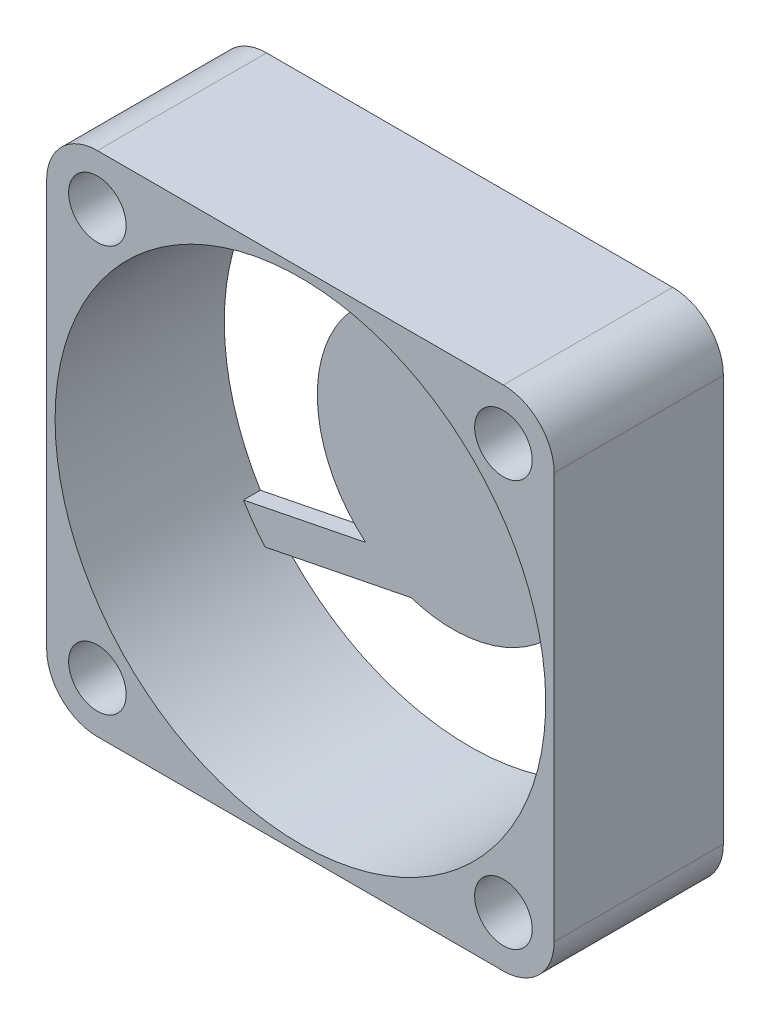
ISO-10303-21;
HEADER;
FILE_DESCRIPTION(('STEP AP214'),'2;1');
FILE_NAME('part.step','',(''),(''),'','','');
FILE_SCHEMA(('AUTOMOTIVE_DESIGN { 1 0 10303 214 1 1 1 1 }'));
ENDSEC;
DATA;
#1=APPLICATION_CONTEXT('core data for automotive mechanical design processes');
#2=APPLICATION_PROTOCOL_DEFINITION('international standard','automotive_design',2000,#1);
#3=PRODUCT_CONTEXT('',#1,'mechanical');
#4=PRODUCT('Part','Part','',(#3));
#5=PRODUCT_RELATED_PRODUCT_CATEGORY('part','',(#4));
#6=PRODUCT_DEFINITION_FORMATION('','',#4);
#7=PRODUCT_DEFINITION_CONTEXT('part definition',#1,'design');
#8=PRODUCT_DEFINITION('design','',#6,#7);
#9=PRODUCT_DEFINITION_SHAPE('','',#8);
#10=(LENGTH_UNIT() NAMED_UNIT(*) SI_UNIT(.MILLI.,.METRE.));
#11=(NAMED_UNIT(*) PLANE_ANGLE_UNIT() SI_UNIT($,.RADIAN.));
#12=(NAMED_UNIT(*) SI_UNIT($,.STERADIAN.) SOLID_ANGLE_UNIT());
#13=UNCERTAINTY_MEASURE_WITH_UNIT(LENGTH_MEASURE(1.E-05),#10,'distance_accuracy_value','');
#14=(GEOMETRIC_REPRESENTATION_CONTEXT(3) GLOBAL_UNCERTAINTY_ASSIGNED_CONTEXT((#13)) GLOBAL_UNIT_ASSIGNED_CONTEXT((#10,
#11,#12)) REPRESENTATION_CONTEXT('',''));
#15=CARTESIAN_POINT('',(0.,0.,0.));
#16=DIRECTION('',(0.,0.,1.));
#17=DIRECTION('',(1.,0.,0.));
#18=AXIS2_PLACEMENT_3D('',#15,#16,#17);
#19=CARTESIAN_POINT('',(-12.,-12.,-3.5));
#20=DIRECTION('',(0.,0.,-1.));
#21=DIRECTION('',(-1.,0.,0.));
#22=AXIS2_PLACEMENT_3D('',#19,#20,#21);
#23=PLANE('',#22);
#24=CARTESIAN_POINT('',(-12.,12.,-3.5));
#25=DIRECTION('',(0.,0.,1.));
#26=DIRECTION('',(1.,0.,0.));
#27=AXIS2_PLACEMENT_3D('',#24,#25,#26);
#28=CIRCLE('',#27,1.7);
#29=CARTESIAN_POINT('',(-10.3,12.,-3.5));
#30=VERTEX_POINT('',#29);
#31=EDGE_CURVE('E562',#30,#30,#28,.T.);
#32=ORIENTED_EDGE('',*,*,#31,.T.);
#33=EDGE_LOOP('',(#32));
#34=FACE_BOUND('',#33,.T.);
#35=CARTESIAN_POINT('',(-12.,-12.,-3.5));
#36=DIRECTION('',(0.,0.,1.));
#37=DIRECTION('',(1.,0.,0.));
#38=AXIS2_PLACEMENT_3D('',#35,#36,#37);
#39=CIRCLE('',#38,1.7);
#40=CARTESIAN_POINT('',(-10.3,-12.,-3.5));
#41=VERTEX_POINT('',#40);
#42=EDGE_CURVE('E567',#41,#41,#39,.T.);
#43=ORIENTED_EDGE('',*,*,#42,.T.);
#44=EDGE_LOOP('',(#43));
#45=FACE_BOUND('',#44,.T.);
#46=CARTESIAN_POINT('',(12.,12.,-3.5));
#47=DIRECTION('',(0.,0.,1.));
#48=DIRECTION('',(1.,0.,0.));
#49=AXIS2_PLACEMENT_3D('',#46,#47,#48);
#50=CIRCLE('',#49,1.7);
#51=CARTESIAN_POINT('',(13.7,12.,-3.5));
#52=VERTEX_POINT('',#51);
#53=EDGE_CURVE('E185',#52,#52,#50,.T.);
#54=ORIENTED_EDGE('',*,*,#53,.T.);
#55=EDGE_LOOP('',(#54));
#56=FACE_BOUND('',#55,.T.);
#57=CARTESIAN_POINT('',(0.,0.,-3.5));
#58=DIRECTION('',(0.,0.,-1.));
#59=DIRECTION('',(1.,0.,0.));
#60=AXIS2_PLACEMENT_3D('',#57,#58,#59);
#61=CIRCLE('',#60,8.);
#62=CARTESIAN_POINT('',(-5.14365313508418,-6.12722061182219,-3.5));
#63=VERTEX_POINT('',#62);
#64=CARTESIAN_POINT('',(-0.948221665096396,7.94360596164247,-3.5));
#65=VERTEX_POINT('',#64);
#66=EDGE_CURVE('E370',#63,#65,#61,.T.);
#67=ORIENTED_EDGE('',*,*,#66,.T.);
#68=DIRECTION('',(0.,1.,0.));
#69=VECTOR('',#68,1.);
#70=CARTESIAN_POINT('',(-0.948221665096396,14.4689624947279,-3.5));
#71=LINE('',#70,#69);
#72=CARTESIAN_POINT('',(-0.948221665096397,14.4689624947279,-3.5));
#73=VERTEX_POINT('',#72);
#74=EDGE_CURVE('E373',#65,#73,#71,.T.);
#75=ORIENTED_EDGE('',*,*,#74,.T.);
#76=CARTESIAN_POINT('',(0.,0.,-3.5));
#77=DIRECTION('',(0.,0.,1.));
#78=DIRECTION('',(-1.,0.,0.));
#79=AXIS2_PLACEMENT_3D('',#76,#77,#78);
#80=CIRCLE('',#79,14.5);
#81=CARTESIAN_POINT('',(-12.3673093809388,-7.56965380160431,-3.5));
#82=VERTEX_POINT('',#81);
#83=EDGE_CURVE('E51',#73,#82,#80,.T.);
#84=ORIENTED_EDGE('',*,*,#83,.T.);
#85=DIRECTION('',(0.980640624208247,0.195816153961972,0.));
#86=VECTOR('',#85,1.);
#87=CARTESIAN_POINT('',(-5.14365313508418,-6.12722061182219,-3.5));
#88=LINE('',#87,#86);
#89=EDGE_CURVE('E377',#82,#63,#88,.T.);
#90=ORIENTED_EDGE('',*,*,#89,.T.);
#91=EDGE_LOOP('',(#67,#75,#84,#90));
#92=FACE_BOUND('',#91,.T.);
#93=CARTESIAN_POINT('',(0.,0.,-3.5));
#94=DIRECTION('',(0.,0.,1.));
#95=DIRECTION('',(-1.,0.,0.));
#96=AXIS2_PLACEMENT_3D('',#93,#94,#95);
#97=CIRCLE('',#96,14.5);
#98=CARTESIAN_POINT('',(12.9798089309148,-6.46332423114802,-3.5));
#99=VERTEX_POINT('',#98);
#100=CARTESIAN_POINT('',(0.941176470591484,14.4694224781504,-3.5));
#101=VERTEX_POINT('',#100);
#102=EDGE_CURVE('E384',#99,#101,#97,.T.);
#103=ORIENTED_EDGE('',*,*,#102,.T.);
#104=DIRECTION('',(0.,-1.,0.));
#105=VECTOR('',#104,1.);
#106=CARTESIAN_POINT('',(0.941176470591484,7.94444377229803,-3.5));
#107=LINE('',#106,#105);
#108=CARTESIAN_POINT('',(0.941176470591484,7.94444377229803,-3.5));
#109=VERTEX_POINT('',#108);
#110=EDGE_CURVE('E394',#101,#109,#107,.T.);
#111=ORIENTED_EDGE('',*,*,#110,.T.);
#112=CARTESIAN_POINT('',(0.,0.,-3.5));
#113=DIRECTION('',(0.,0.,-1.));
#114=DIRECTION('',(1.,0.,0.));
#115=AXIS2_PLACEMENT_3D('',#112,#113,#114);
#116=CIRCLE('',#115,8.);
#117=CARTESIAN_POINT('',(7.3506783610416,-3.15713915317566,-3.5));
#118=VERTEX_POINT('',#117);
#119=EDGE_CURVE('E59',#109,#118,#116,.T.);
#120=ORIENTED_EDGE('',*,*,#119,.T.);
#121=DIRECTION('',(0.862273300841668,-0.506443239322646,0.));
#122=VECTOR('',#121,1.);
#123=CARTESIAN_POINT('',(12.9798089309148,-6.46332423114802,-3.5));
#124=LINE('',#123,#122);
#125=EDGE_CURVE('E398',#118,#99,#124,.T.);
#126=ORIENTED_EDGE('',*,*,#125,.T.);
#127=EDGE_LOOP('',(#103,#111,#120,#126));
#128=FACE_BOUND('',#127,.T.);
#129=CARTESIAN_POINT('',(0.,0.,-3.5));
#130=DIRECTION('',(0.,0.,-1.));
#131=DIRECTION('',(1.,0.,0.));
#132=AXIS2_PLACEMENT_3D('',#129,#130,#131);
#133=CIRCLE('',#132,8.);
#134=CARTESIAN_POINT('',(6.4095018905007,-4.78730461905945,-3.5));
#135=VERTEX_POINT('',#134);
#136=CARTESIAN_POINT('',(-2.45943331204056,-7.61256775231756,-3.5));
#137=VERTEX_POINT('',#136);
#138=EDGE_CURVE('E348',#135,#137,#133,.T.);
#139=ORIENTED_EDGE('',*,*,#138,.T.);
#140=DIRECTION('',(-0.980640624208247,-0.195816153961972,0.));
#141=VECTOR('',#140,1.);
#142=CARTESIAN_POINT('',(-11.0939443944739,-9.33672307462966,-3.5));
#143=LINE('',#142,#141);
#144=CARTESIAN_POINT('',(-11.0939443944739,-9.33672307462966,-3.5));
#145=VERTEX_POINT('',#144);
#146=EDGE_CURVE('E198',#137,#145,#143,.T.);
#147=ORIENTED_EDGE('',*,*,#146,.T.);
#148=CARTESIAN_POINT('',(0.,0.,-3.5));
#149=DIRECTION('',(0.,0.,1.));
#150=DIRECTION('',(-1.,0.,0.));
#151=AXIS2_PLACEMENT_3D('',#148,#149,#150);
#152=CIRCLE('',#151,14.5);
#153=CARTESIAN_POINT('',(12.033174961859,-8.09028431745695,-3.5));
#154=VERTEX_POINT('',#153);
#155=EDGE_CURVE('E206',#145,#154,#152,.T.);
#156=ORIENTED_EDGE('',*,*,#155,.T.);
#157=DIRECTION('',(-0.862273300841668,0.506443239322646,0.));
#158=VECTOR('',#157,1.);
#159=CARTESIAN_POINT('',(6.4095018905007,-4.78730461905945,-3.5));
#160=LINE('',#159,#158);
#161=EDGE_CURVE('E201',#154,#135,#160,.T.);
#162=ORIENTED_EDGE('',*,*,#161,.T.);
#163=EDGE_LOOP('',(#139,#147,#156,#162));
#164=FACE_BOUND('',#163,.T.);
#165=CARTESIAN_POINT('',(-12.,-12.,-3.5));
#166=DIRECTION('',(0.,0.,1.));
#167=DIRECTION('',(-1.,0.,0.));
#168=AXIS2_PLACEMENT_3D('',#165,#166,#167);
#169=CIRCLE('',#168,3.);
#170=CARTESIAN_POINT('',(-15.,-12.,-3.5));
#171=VERTEX_POINT('',#170);
#172=CARTESIAN_POINT('',(-12.,-15.,-3.5));
#173=VERTEX_POINT('',#172);
#174=EDGE_CURVE('E210',#171,#173,#169,.T.);
#175=ORIENTED_EDGE('',*,*,#174,.F.);
#176=DIRECTION('',(0.,-1.,0.));
#177=VECTOR('',#176,1.);
#178=CARTESIAN_POINT('',(-15.,-12.,-3.5));
#179=LINE('',#178,#177);
#180=CARTESIAN_POINT('',(-15.,12.,-3.5));
#181=VERTEX_POINT('',#180);
#182=EDGE_CURVE('E232',#181,#171,#179,.T.);
#183=ORIENTED_EDGE('',*,*,#182,.F.);
#184=CARTESIAN_POINT('',(-12.,12.,-3.5));
#185=DIRECTION('',(0.,0.,1.));
#186=DIRECTION('',(-1.,0.,0.));
#187=AXIS2_PLACEMENT_3D('',#184,#185,#186);
#188=CIRCLE('',#187,3.);
#189=CARTESIAN_POINT('',(-12.,15.,-3.5));
#190=VERTEX_POINT('',#189);
#191=EDGE_CURVE('E229',#190,#181,#188,.T.);
#192=ORIENTED_EDGE('',*,*,#191,.F.);
#193=DIRECTION('',(-1.,0.,0.));
#194=VECTOR('',#193,1.);
#195=CARTESIAN_POINT('',(-12.,15.,-3.5));
#196=LINE('',#195,#194);
#197=CARTESIAN_POINT('',(12.,15.,-3.5));
#198=VERTEX_POINT('',#197);
#199=EDGE_CURVE('E226',#198,#190,#196,.T.);
#200=ORIENTED_EDGE('',*,*,#199,.F.);
#201=CARTESIAN_POINT('',(12.,12.,-3.5));
#202=DIRECTION('',(0.,0.,1.));
#203=DIRECTION('',(-1.,0.,0.));
#204=AXIS2_PLACEMENT_3D('',#201,#202,#203);
#205=CIRCLE('',#204,3.);
#206=CARTESIAN_POINT('',(15.,12.,-3.5));
#207=VERTEX_POINT('',#206);
#208=EDGE_CURVE('E223',#207,#198,#205,.T.);
#209=ORIENTED_EDGE('',*,*,#208,.F.);
#210=DIRECTION('',(0.,1.,0.));
#211=VECTOR('',#210,1.);
#212=CARTESIAN_POINT('',(15.,-12.,-3.5));
#213=LINE('',#212,#211);
#214=CARTESIAN_POINT('',(15.,-12.,-3.5));
#215=VERTEX_POINT('',#214);
#216=EDGE_CURVE('E220',#215,#207,#213,.T.);
#217=ORIENTED_EDGE('',*,*,#216,.F.);
#218=CARTESIAN_POINT('',(12.,-12.,-3.5));
#219=DIRECTION('',(0.,0.,1.));
#220=DIRECTION('',(1.,0.,0.));
#221=AXIS2_PLACEMENT_3D('',#218,#219,#220);
#222=CIRCLE('',#221,3.);
#223=CARTESIAN_POINT('',(12.,-15.,-3.5));
#224=VERTEX_POINT('',#223);
#225=EDGE_CURVE('E217',#224,#215,#222,.T.);
#226=ORIENTED_EDGE('',*,*,#225,.F.);
#227=DIRECTION('',(1.,0.,0.));
#228=VECTOR('',#227,1.);
#229=CARTESIAN_POINT('',(-12.,-15.,-3.5));
#230=LINE('',#229,#228);
#231=EDGE_CURVE('E213',#173,#224,#230,.T.);
#232=ORIENTED_EDGE('',*,*,#231,.F.);
#233=EDGE_LOOP('',(#175,#183,#192,#200,#209,#217,#226,#232));
#234=FACE_BOUND('',#233,.T.);
#235=CARTESIAN_POINT('',(12.,-12.,-3.5));
#236=DIRECTION('',(0.,0.,1.));
#237=DIRECTION('',(1.,0.,0.));
#238=AXIS2_PLACEMENT_3D('',#235,#236,#237);
#239=CIRCLE('',#238,1.7);
#240=CARTESIAN_POINT('',(13.7,-12.,-3.5));
#241=VERTEX_POINT('',#240);
#242=EDGE_CURVE('E571',#241,#241,#239,.T.);
#243=ORIENTED_EDGE('',*,*,#242,.T.);
#244=EDGE_LOOP('',(#243));
#245=FACE_BOUND('',#244,.T.);
#246=ADVANCED_FACE('F34',(#34,#45,#56,#92,#128,#164,#234,#245),#23,.T.);
#247=CARTESIAN_POINT('',(-12.,-12.,-3.5));
#248=DIRECTION('',(0.,0.,1.));
#249=DIRECTION('',(1.,0.,0.));
#250=AXIS2_PLACEMENT_3D('',#247,#248,#249);
#251=CYLINDRICAL_SURFACE('',#250,3.);
#252=CARTESIAN_POINT('',(-12.,-12.,6.5));
#253=DIRECTION('',(0.,0.,1.));
#254=DIRECTION('',(-1.,0.,0.));
#255=AXIS2_PLACEMENT_3D('',#252,#253,#254);
#256=CIRCLE('',#255,3.);
#257=CARTESIAN_POINT('',(-15.,-12.,6.5));
#258=VERTEX_POINT('',#257);
#259=CARTESIAN_POINT('',(-12.,-15.,6.5));
#260=VERTEX_POINT('',#259);
#261=EDGE_CURVE('E235',#258,#260,#256,.T.);
#262=ORIENTED_EDGE('',*,*,#261,.F.);
#263=DIRECTION('',(0.,0.,1.));
#264=VECTOR('',#263,1.);
#265=CARTESIAN_POINT('',(-15.,-12.,-3.5));
#266=LINE('',#265,#264);
#267=EDGE_CURVE('E12',#171,#258,#266,.T.);
#268=ORIENTED_EDGE('',*,*,#267,.F.);
#269=ORIENTED_EDGE('',*,*,#174,.T.);
#270=DIRECTION('',(0.,0.,1.));
#271=VECTOR('',#270,1.);
#272=CARTESIAN_POINT('',(-12.,-15.,-3.5));
#273=LINE('',#272,#271);
#274=EDGE_CURVE('E38',#173,#260,#273,.T.);
#275=ORIENTED_EDGE('',*,*,#274,.T.);
#276=EDGE_LOOP('',(#262,#268,#269,#275));
#277=FACE_BOUND('',#276,.T.);
#278=ADVANCED_FACE('F36',(#277),#251,.T.);
#279=CARTESIAN_POINT('',(-15.,-12.,-3.5));
#280=DIRECTION('',(-1.,0.,0.));
#281=DIRECTION('',(0.,0.,1.));
#282=AXIS2_PLACEMENT_3D('',#279,#280,#281);
#283=PLANE('',#282);
#284=DIRECTION('',(0.,-1.,0.));
#285=VECTOR('',#284,1.);
#286=CARTESIAN_POINT('',(-15.,-12.,6.5));
#287=LINE('',#286,#285);
#288=CARTESIAN_POINT('',(-15.,12.,6.5));
#289=VERTEX_POINT('',#288);
#290=EDGE_CURVE('E214',#289,#258,#287,.T.);
#291=ORIENTED_EDGE('',*,*,#290,.F.);
#292=DIRECTION('',(0.,0.,1.));
#293=VECTOR('',#292,1.);
#294=CARTESIAN_POINT('',(-15.,12.,-3.5));
#295=LINE('',#294,#293);
#296=EDGE_CURVE('E43',#181,#289,#295,.T.);
#297=ORIENTED_EDGE('',*,*,#296,.F.);
#298=ORIENTED_EDGE('',*,*,#182,.T.);
#299=ORIENTED_EDGE('',*,*,#267,.T.);
#300=EDGE_LOOP('',(#291,#297,#298,#299));
#301=FACE_BOUND('',#300,.T.);
#302=ADVANCED_FACE('F280',(#301),#283,.T.);
#303=CARTESIAN_POINT('',(-12.,12.,-3.5));
#304=DIRECTION('',(0.,0.,1.));
#305=DIRECTION('',(1.,0.,0.));
#306=AXIS2_PLACEMENT_3D('',#303,#304,#305);
#307=CYLINDRICAL_SURFACE('',#306,3.);
#308=CARTESIAN_POINT('',(-12.,12.,6.5));
#309=DIRECTION('',(0.,0.,1.));
#310=DIRECTION('',(-1.,0.,0.));
#311=AXIS2_PLACEMENT_3D('',#308,#309,#310);
#312=CIRCLE('',#311,3.);
#313=CARTESIAN_POINT('',(-12.,15.,6.5));
#314=VERTEX_POINT('',#313);
#315=EDGE_CURVE('E253',#314,#289,#312,.T.);
#316=ORIENTED_EDGE('',*,*,#315,.F.);
#317=DIRECTION('',(0.,0.,1.));
#318=VECTOR('',#317,1.);
#319=CARTESIAN_POINT('',(-12.,15.,-3.5));
#320=LINE('',#319,#318);
#321=EDGE_CURVE('E259',#190,#314,#320,.T.);
#322=ORIENTED_EDGE('',*,*,#321,.F.);
#323=ORIENTED_EDGE('',*,*,#191,.T.);
#324=ORIENTED_EDGE('',*,*,#296,.T.);
#325=EDGE_LOOP('',(#316,#322,#323,#324));
#326=FACE_BOUND('',#325,.T.);
#327=ADVANCED_FACE('F301',(#326),#307,.T.);
#328=CARTESIAN_POINT('',(-12.,15.,-3.5));
#329=DIRECTION('',(0.,1.,0.));
#330=DIRECTION('',(-1.,0.,0.));
#331=AXIS2_PLACEMENT_3D('',#328,#329,#330);
#332=PLANE('',#331);
#333=DIRECTION('',(-1.,0.,0.));
#334=VECTOR('',#333,1.);
#335=CARTESIAN_POINT('',(-12.,15.,6.5));
#336=LINE('',#335,#334);
#337=CARTESIAN_POINT('',(12.,15.,6.5));
#338=VERTEX_POINT('',#337);
#339=EDGE_CURVE('E250',#338,#314,#336,.T.);
#340=ORIENTED_EDGE('',*,*,#339,.F.);
#341=DIRECTION('',(0.,0.,1.));
#342=VECTOR('',#341,1.);
#343=CARTESIAN_POINT('',(12.,15.,-3.5));
#344=LINE('',#343,#342);
#345=EDGE_CURVE('E261',#198,#338,#344,.T.);
#346=ORIENTED_EDGE('',*,*,#345,.F.);
#347=ORIENTED_EDGE('',*,*,#199,.T.);
#348=ORIENTED_EDGE('',*,*,#321,.T.);
#349=EDGE_LOOP('',(#340,#346,#347,#348));
#350=FACE_BOUND('',#349,.T.);
#351=ADVANCED_FACE('F299',(#350),#332,.T.);
#352=CARTESIAN_POINT('',(12.,12.,-3.5));
#353=DIRECTION('',(0.,0.,1.));
#354=DIRECTION('',(1.,0.,0.));
#355=AXIS2_PLACEMENT_3D('',#352,#353,#354);
#356=CYLINDRICAL_SURFACE('',#355,3.);
#357=CARTESIAN_POINT('',(12.,12.,6.5));
#358=DIRECTION('',(0.,0.,1.));
#359=DIRECTION('',(-1.,0.,0.));
#360=AXIS2_PLACEMENT_3D('',#357,#358,#359);
#361=CIRCLE('',#360,3.);
#362=CARTESIAN_POINT('',(15.,12.,6.5));
#363=VERTEX_POINT('',#362);
#364=EDGE_CURVE('E247',#363,#338,#361,.T.);
#365=ORIENTED_EDGE('',*,*,#364,.F.);
#366=DIRECTION('',(0.,0.,1.));
#367=VECTOR('',#366,1.);
#368=CARTESIAN_POINT('',(15.,12.,-3.5));
#369=LINE('',#368,#367);
#370=EDGE_CURVE('E263',#207,#363,#369,.T.);
#371=ORIENTED_EDGE('',*,*,#370,.F.);
#372=ORIENTED_EDGE('',*,*,#208,.T.);
#373=ORIENTED_EDGE('',*,*,#345,.T.);
#374=EDGE_LOOP('',(#365,#371,#372,#373));
#375=FACE_BOUND('',#374,.T.);
#376=ADVANCED_FACE('F295',(#375),#356,.T.);
#377=CARTESIAN_POINT('',(15.,-12.,-3.5));
#378=DIRECTION('',(1.,0.,0.));
#379=DIRECTION('',(0.,1.,0.));
#380=AXIS2_PLACEMENT_3D('',#377,#378,#379);
#381=PLANE('',#380);
#382=DIRECTION('',(0.,1.,0.));
#383=VECTOR('',#382,1.);
#384=CARTESIAN_POINT('',(15.,-12.,6.5));
#385=LINE('',#384,#383);
#386=CARTESIAN_POINT('',(15.,-12.,6.5));
#387=VERTEX_POINT('',#386);
#388=EDGE_CURVE('E244',#387,#363,#385,.T.);
#389=ORIENTED_EDGE('',*,*,#388,.F.);
#390=DIRECTION('',(0.,0.,1.));
#391=VECTOR('',#390,1.);
#392=CARTESIAN_POINT('',(15.,-12.,-3.5));
#393=LINE('',#392,#391);
#394=EDGE_CURVE('E265',#215,#387,#393,.T.);
#395=ORIENTED_EDGE('',*,*,#394,.F.);
#396=ORIENTED_EDGE('',*,*,#216,.T.);
#397=ORIENTED_EDGE('',*,*,#370,.T.);
#398=EDGE_LOOP('',(#389,#395,#396,#397));
#399=FACE_BOUND('',#398,.T.);
#400=ADVANCED_FACE('F293',(#399),#381,.T.);
#401=CARTESIAN_POINT('',(12.,-12.,-3.5));
#402=DIRECTION('',(0.,0.,1.));
#403=DIRECTION('',(1.,0.,0.));
#404=AXIS2_PLACEMENT_3D('',#401,#402,#403);
#405=CYLINDRICAL_SURFACE('',#404,3.);
#406=CARTESIAN_POINT('',(12.,-12.,6.5));
#407=DIRECTION('',(0.,0.,1.));
#408=DIRECTION('',(1.,0.,0.));
#409=AXIS2_PLACEMENT_3D('',#406,#407,#408);
#410=CIRCLE('',#409,3.);
#411=CARTESIAN_POINT('',(12.,-15.,6.5));
#412=VERTEX_POINT('',#411);
#413=EDGE_CURVE('E241',#412,#387,#410,.T.);
#414=ORIENTED_EDGE('',*,*,#413,.F.);
#415=DIRECTION('',(0.,0.,1.));
#416=VECTOR('',#415,1.);
#417=CARTESIAN_POINT('',(12.,-15.,-3.5));
#418=LINE('',#417,#416);
#419=EDGE_CURVE('E266',#224,#412,#418,.T.);
#420=ORIENTED_EDGE('',*,*,#419,.F.);
#421=ORIENTED_EDGE('',*,*,#225,.T.);
#422=ORIENTED_EDGE('',*,*,#394,.T.);
#423=EDGE_LOOP('',(#414,#420,#421,#422));
#424=FACE_BOUND('',#423,.T.);
#425=ADVANCED_FACE('F289',(#424),#405,.T.);
#426=CARTESIAN_POINT('',(-12.,-15.,-3.5));
#427=DIRECTION('',(0.,-1.,0.));
#428=DIRECTION('',(1.,0.,0.));
#429=AXIS2_PLACEMENT_3D('',#426,#427,#428);
#430=PLANE('',#429);
#431=DIRECTION('',(1.,0.,0.));
#432=VECTOR('',#431,1.);
#433=CARTESIAN_POINT('',(-12.,-15.,6.5));
#434=LINE('',#433,#432);
#435=EDGE_CURVE('E238',#260,#412,#434,.T.);
#436=ORIENTED_EDGE('',*,*,#435,.F.);
#437=ORIENTED_EDGE('',*,*,#274,.F.);
#438=ORIENTED_EDGE('',*,*,#231,.T.);
#439=ORIENTED_EDGE('',*,*,#419,.T.);
#440=EDGE_LOOP('',(#436,#437,#438,#439));
#441=FACE_BOUND('',#440,.T.);
#442=ADVANCED_FACE('F274',(#441),#430,.T.);
#443=CARTESIAN_POINT('',(-12.,-12.,6.5));
#444=DIRECTION('',(0.,0.,-1.));
#445=DIRECTION('',(-1.,0.,0.));
#446=AXIS2_PLACEMENT_3D('',#443,#444,#445);
#447=PLANE('',#446);
#448=CARTESIAN_POINT('',(-12.,12.,6.5));
#449=DIRECTION('',(0.,0.,1.));
#450=DIRECTION('',(1.,0.,0.));
#451=AXIS2_PLACEMENT_3D('',#448,#449,#450);
#452=CIRCLE('',#451,1.7);
#453=CARTESIAN_POINT('',(-10.3,12.,6.5));
#454=VERTEX_POINT('',#453);
#455=EDGE_CURVE('E331',#454,#454,#452,.T.);
#456=ORIENTED_EDGE('',*,*,#455,.F.);
#457=EDGE_LOOP('',(#456));
#458=FACE_BOUND('',#457,.T.);
#459=CARTESIAN_POINT('',(-12.,-12.,6.5));
#460=DIRECTION('',(0.,0.,1.));
#461=DIRECTION('',(1.,0.,0.));
#462=AXIS2_PLACEMENT_3D('',#459,#460,#461);
#463=CIRCLE('',#462,1.7);
#464=CARTESIAN_POINT('',(-10.3,-12.,6.5));
#465=VERTEX_POINT('',#464);
#466=EDGE_CURVE('E335',#465,#465,#463,.T.);
#467=ORIENTED_EDGE('',*,*,#466,.F.);
#468=EDGE_LOOP('',(#467));
#469=FACE_BOUND('',#468,.T.);
#470=CARTESIAN_POINT('',(12.,-12.,6.5));
#471=DIRECTION('',(0.,0.,1.));
#472=DIRECTION('',(1.,0.,0.));
#473=AXIS2_PLACEMENT_3D('',#470,#471,#472);
#474=CIRCLE('',#473,1.7);
#475=CARTESIAN_POINT('',(13.7,-12.,6.5));
#476=VERTEX_POINT('',#475);
#477=EDGE_CURVE('E339',#476,#476,#474,.T.);
#478=ORIENTED_EDGE('',*,*,#477,.F.);
#479=EDGE_LOOP('',(#478));
#480=FACE_BOUND('',#479,.T.);
#481=CARTESIAN_POINT('',(12.,12.,6.5));
#482=DIRECTION('',(0.,0.,1.));
#483=DIRECTION('',(1.,0.,0.));
#484=AXIS2_PLACEMENT_3D('',#481,#482,#483);
#485=CIRCLE('',#484,1.7);
#486=CARTESIAN_POINT('',(13.7,12.,6.5));
#487=VERTEX_POINT('',#486);
#488=EDGE_CURVE('E343',#487,#487,#485,.T.);
#489=ORIENTED_EDGE('',*,*,#488,.F.);
#490=EDGE_LOOP('',(#489));
#491=FACE_BOUND('',#490,.T.);
#492=CARTESIAN_POINT('',(0.,0.,6.5));
#493=DIRECTION('',(0.,0.,1.));
#494=DIRECTION('',(-1.,0.,0.));
#495=AXIS2_PLACEMENT_3D('',#492,#493,#494);
#496=CIRCLE('',#495,14.5);
#497=CARTESIAN_POINT('',(-14.5,0.,6.5));
#498=VERTEX_POINT('',#497);
#499=EDGE_CURVE('E346',#498,#498,#496,.T.);
#500=ORIENTED_EDGE('',*,*,#499,.F.);
#501=EDGE_LOOP('',(#500));
#502=FACE_BOUND('',#501,.T.);
#503=ORIENTED_EDGE('',*,*,#261,.T.);
#504=ORIENTED_EDGE('',*,*,#435,.T.);
#505=ORIENTED_EDGE('',*,*,#413,.T.);
#506=ORIENTED_EDGE('',*,*,#388,.T.);
#507=ORIENTED_EDGE('',*,*,#364,.T.);
#508=ORIENTED_EDGE('',*,*,#339,.T.);
#509=ORIENTED_EDGE('',*,*,#315,.T.);
#510=ORIENTED_EDGE('',*,*,#290,.T.);
#511=EDGE_LOOP('',(#503,#504,#505,#506,#507,#508,#509,#510));
#512=FACE_BOUND('',#511,.T.);
#513=ADVANCED_FACE('F276',(#458,#469,#480,#491,#502,#512),#447,.F.);
#514=CARTESIAN_POINT('',(0.,0.,-3.5));
#515=DIRECTION('',(0.,0.,1.));
#516=DIRECTION('',(1.,0.,0.));
#517=AXIS2_PLACEMENT_3D('',#514,#515,#516);
#518=CYLINDRICAL_SURFACE('',#517,8.);
#519=DIRECTION('',(0.,0.,1.));
#520=VECTOR('',#519,1.);
#521=CARTESIAN_POINT('',(6.4095018905007,-4.78730461905945,-3.5));
#522=LINE('',#521,#520);
#523=CARTESIAN_POINT('',(6.4095018905007,-4.78730461905945,-2.5));
#524=VERTEX_POINT('',#523);
#525=EDGE_CURVE('E193',#135,#524,#522,.T.);
#526=ORIENTED_EDGE('',*,*,#525,.T.);
#527=CARTESIAN_POINT('',(0.,0.,-2.5));
#528=DIRECTION('',(0.,0.,-1.));
#529=DIRECTION('',(-1.,0.,0.));
#530=AXIS2_PLACEMENT_3D('',#527,#528,#529);
#531=CIRCLE('',#530,7.99999999999999);
#532=CARTESIAN_POINT('',(-2.45943331204056,-7.61256775231756,-2.5));
#533=VERTEX_POINT('',#532);
#534=EDGE_CURVE('E177',#533,#524,#531,.F.);
#535=ORIENTED_EDGE('',*,*,#534,.F.);
#536=DIRECTION('',(0.,0.,1.));
#537=VECTOR('',#536,1.);
#538=CARTESIAN_POINT('',(-2.45943331204056,-7.61256775231756,-3.5));
#539=LINE('',#538,#537);
#540=EDGE_CURVE('E191',#137,#533,#539,.T.);
#541=ORIENTED_EDGE('',*,*,#540,.F.);
#542=ORIENTED_EDGE('',*,*,#138,.F.);
#543=EDGE_LOOP('',(#526,#535,#541,#542));
#544=FACE_BOUND('',#543,.T.);
#545=ADVANCED_FACE('F189',(#544),#518,.T.);
#546=CARTESIAN_POINT('',(6.4095018905007,-4.78730461905945,-3.5));
#547=DIRECTION('',(0.506443239322646,0.862273300841668,0.));
#548=DIRECTION('',(-0.862273300841668,0.506443239322646,0.));
#549=AXIS2_PLACEMENT_3D('',#546,#547,#548);
#550=PLANE('',#549);
#551=DIRECTION('',(0.,0.,1.));
#552=VECTOR('',#551,1.);
#553=CARTESIAN_POINT('',(12.033174961859,-8.09028431745695,-3.5));
#554=LINE('',#553,#552);
#555=CARTESIAN_POINT('',(12.033174961859,-8.09028431745695,-2.5));
#556=VERTEX_POINT('',#555);
#557=EDGE_CURVE('E203',#154,#556,#554,.T.);
#558=ORIENTED_EDGE('',*,*,#557,.T.);
#559=DIRECTION('',(0.862273300841668,-0.506443239322646,0.));
#560=VECTOR('',#559,1.);
#561=CARTESIAN_POINT('',(6.4095018905007,-4.78730461905945,-2.5));
#562=LINE('',#561,#560);
#563=EDGE_CURVE('E194',#524,#556,#562,.T.);
#564=ORIENTED_EDGE('',*,*,#563,.F.);
#565=ORIENTED_EDGE('',*,*,#525,.F.);
#566=ORIENTED_EDGE('',*,*,#161,.F.);
#567=EDGE_LOOP('',(#558,#564,#565,#566));
#568=FACE_BOUND('',#567,.T.);
#569=ADVANCED_FACE('F327',(#568),#550,.F.);
#570=CARTESIAN_POINT('',(0.,0.,-3.5));
#571=DIRECTION('',(0.,0.,1.));
#572=DIRECTION('',(1.,0.,0.));
#573=AXIS2_PLACEMENT_3D('',#570,#571,#572);
#574=CYLINDRICAL_SURFACE('',#573,14.5);
#575=ORIENTED_EDGE('',*,*,#499,.T.);
#576=EDGE_LOOP('',(#575));
#577=FACE_BOUND('',#576,.T.);
#578=CARTESIAN_POINT('',(0.,0.,-2.5));
#579=DIRECTION('',(0.,0.,-1.));
#580=DIRECTION('',(-1.,0.,0.));
#581=AXIS2_PLACEMENT_3D('',#578,#579,#580);
#582=CIRCLE('',#581,14.5);
#583=CARTESIAN_POINT('',(12.9798089309148,-6.46332423114803,-2.5));
#584=VERTEX_POINT('',#583);
#585=EDGE_CURVE('E362',#556,#584,#582,.F.);
#586=ORIENTED_EDGE('',*,*,#585,.F.);
#587=ORIENTED_EDGE('',*,*,#557,.F.);
#588=ORIENTED_EDGE('',*,*,#155,.F.);
#589=DIRECTION('',(0.,0.,1.));
#590=VECTOR('',#589,1.);
#591=CARTESIAN_POINT('',(-11.0939443944739,-9.33672307462966,-3.5));
#592=LINE('',#591,#590);
#593=CARTESIAN_POINT('',(-11.0939443944739,-9.33672307462966,-2.5));
#594=VERTEX_POINT('',#593);
#595=EDGE_CURVE('E200',#145,#594,#592,.T.);
#596=ORIENTED_EDGE('',*,*,#595,.T.);
#597=CARTESIAN_POINT('',(0.,0.,-2.5));
#598=DIRECTION('',(0.,0.,-1.));
#599=DIRECTION('',(-1.,0.,0.));
#600=AXIS2_PLACEMENT_3D('',#597,#598,#599);
#601=CIRCLE('',#600,14.5);
#602=CARTESIAN_POINT('',(-12.3673093809388,-7.56965380160431,-2.5));
#603=VERTEX_POINT('',#602);
#604=EDGE_CURVE('E180',#603,#594,#601,.F.);
#605=ORIENTED_EDGE('',*,*,#604,.F.);
#606=DIRECTION('',(0.,0.,1.));
#607=VECTOR('',#606,1.);
#608=CARTESIAN_POINT('',(-12.3673093809388,-7.56965380160431,-3.5));
#609=LINE('',#608,#607);
#610=EDGE_CURVE('E385',#82,#603,#609,.T.);
#611=ORIENTED_EDGE('',*,*,#610,.F.);
#612=ORIENTED_EDGE('',*,*,#83,.F.);
#613=DIRECTION('',(0.,0.,1.));
#614=VECTOR('',#613,1.);
#615=CARTESIAN_POINT('',(-0.948221665096393,14.4689624947279,-3.5));
#616=LINE('',#615,#614);
#617=CARTESIAN_POINT('',(-0.948221665096396,14.4689624947279,-2.5));
#618=VERTEX_POINT('',#617);
#619=EDGE_CURVE('E388',#73,#618,#616,.T.);
#620=ORIENTED_EDGE('',*,*,#619,.T.);
#621=CARTESIAN_POINT('',(0.,0.,-2.5));
#622=DIRECTION('',(0.,0.,-1.));
#623=DIRECTION('',(-1.,0.,0.));
#624=AXIS2_PLACEMENT_3D('',#621,#622,#623);
#625=CIRCLE('',#624,14.5);
#626=CARTESIAN_POINT('',(0.941176470591484,14.4694224781504,-2.5));
#627=VERTEX_POINT('',#626);
#628=EDGE_CURVE('E415',#627,#618,#625,.F.);
#629=ORIENTED_EDGE('',*,*,#628,.F.);
#630=DIRECTION('',(0.,0.,1.));
#631=VECTOR('',#630,1.);
#632=CARTESIAN_POINT('',(0.941176470591484,14.4694224781504,-3.5));
#633=LINE('',#632,#631);
#634=EDGE_CURVE('E400',#101,#627,#633,.T.);
#635=ORIENTED_EDGE('',*,*,#634,.F.);
#636=ORIENTED_EDGE('',*,*,#102,.F.);
#637=DIRECTION('',(0.,0.,1.));
#638=VECTOR('',#637,1.);
#639=CARTESIAN_POINT('',(12.9798089309148,-6.46332423114802,-3.5));
#640=LINE('',#639,#638);
#641=EDGE_CURVE('E349',#99,#584,#640,.T.);
#642=ORIENTED_EDGE('',*,*,#641,.T.);
#643=EDGE_LOOP('',(#586,#587,#588,#596,#605,#611,#612,#620,#629,#635,#636,#642));
#644=FACE_BOUND('',#643,.T.);
#645=ADVANCED_FACE('F361',(#577,#644),#574,.F.);
#646=CARTESIAN_POINT('',(-11.0939443944739,-9.33672307462966,-3.5));
#647=DIRECTION('',(-0.195816153961972,0.980640624208248,0.));
#648=DIRECTION('',(-0.980640624208248,-0.195816153961972,0.));
#649=AXIS2_PLACEMENT_3D('',#646,#647,#648);
#650=PLANE('',#649);
#651=ORIENTED_EDGE('',*,*,#540,.T.);
#652=DIRECTION('',(0.980640624208248,0.195816153961972,0.));
#653=VECTOR('',#652,1.);
#654=CARTESIAN_POINT('',(-11.0939443944739,-9.33672307462966,-2.5));
#655=LINE('',#654,#653);
#656=EDGE_CURVE('E173',#594,#533,#655,.T.);
#657=ORIENTED_EDGE('',*,*,#656,.F.);
#658=ORIENTED_EDGE('',*,*,#595,.F.);
#659=ORIENTED_EDGE('',*,*,#146,.F.);
#660=EDGE_LOOP('',(#651,#657,#658,#659));
#661=FACE_BOUND('',#660,.T.);
#662=ADVANCED_FACE('F196',(#661),#650,.F.);
#663=CARTESIAN_POINT('',(12.9798089309148,-6.46332423114802,-3.5));
#664=DIRECTION('',(-0.506443239322646,-0.862273300841668,0.));
#665=DIRECTION('',(0.862273300841668,-0.506443239322646,0.));
#666=AXIS2_PLACEMENT_3D('',#663,#664,#665);
#667=PLANE('',#666);
#668=DIRECTION('',(0.,0.,1.));
#669=VECTOR('',#668,1.);
#670=CARTESIAN_POINT('',(7.3506783610416,-3.15713915317566,-3.5));
#671=LINE('',#670,#669);
#672=CARTESIAN_POINT('',(7.3506783610416,-3.15713915317566,-2.5));
#673=VERTEX_POINT('',#672);
#674=EDGE_CURVE('E353',#118,#673,#671,.T.);
#675=ORIENTED_EDGE('',*,*,#674,.T.);
#676=DIRECTION('',(-0.862273300841668,0.506443239322645,0.));
#677=VECTOR('',#676,1.);
#678=CARTESIAN_POINT('',(12.9798089309148,-6.46332423114802,-2.5));
#679=LINE('',#678,#677);
#680=EDGE_CURVE('E365',#584,#673,#679,.T.);
#681=ORIENTED_EDGE('',*,*,#680,.F.);
#682=ORIENTED_EDGE('',*,*,#641,.F.);
#683=ORIENTED_EDGE('',*,*,#125,.F.);
#684=EDGE_LOOP('',(#675,#681,#682,#683));
#685=FACE_BOUND('',#684,.T.);
#686=ADVANCED_FACE('F427',(#685),#667,.F.);
#687=CARTESIAN_POINT('',(0.,0.,-3.5));
#688=DIRECTION('',(0.,0.,1.));
#689=DIRECTION('',(1.,0.,0.));
#690=AXIS2_PLACEMENT_3D('',#687,#688,#689);
#691=CYLINDRICAL_SURFACE('',#690,8.);
#692=DIRECTION('',(0.,0.,1.));
#693=VECTOR('',#692,1.);
#694=CARTESIAN_POINT('',(0.941176470591484,7.94444377229803,-3.5));
#695=LINE('',#694,#693);
#696=CARTESIAN_POINT('',(0.941176470591486,7.94444377229802,-2.5));
#697=VERTEX_POINT('',#696);
#698=EDGE_CURVE('E404',#109,#697,#695,.T.);
#699=ORIENTED_EDGE('',*,*,#698,.T.);
#700=CARTESIAN_POINT('',(0.,0.,-2.5));
#701=DIRECTION('',(0.,0.,-1.));
#702=DIRECTION('',(-1.,0.,0.));
#703=AXIS2_PLACEMENT_3D('',#700,#701,#702);
#704=CIRCLE('',#703,8.);
#705=EDGE_CURVE('E420',#673,#697,#704,.F.);
#706=ORIENTED_EDGE('',*,*,#705,.F.);
#707=ORIENTED_EDGE('',*,*,#674,.F.);
#708=ORIENTED_EDGE('',*,*,#119,.F.);
#709=EDGE_LOOP('',(#699,#706,#707,#708));
#710=FACE_BOUND('',#709,.T.);
#711=ADVANCED_FACE('F425',(#710),#691,.T.);
#712=CARTESIAN_POINT('',(0.941176470591484,7.94444377229803,-3.5));
#713=DIRECTION('',(-1.,0.,0.));
#714=DIRECTION('',(0.,0.,1.));
#715=AXIS2_PLACEMENT_3D('',#712,#713,#714);
#716=PLANE('',#715);
#717=ORIENTED_EDGE('',*,*,#634,.T.);
#718=DIRECTION('',(0.,1.,0.));
#719=VECTOR('',#718,1.);
#720=CARTESIAN_POINT('',(0.941176470591484,7.94444377229803,-2.5));
#721=LINE('',#720,#719);
#722=EDGE_CURVE('E414',#697,#627,#721,.T.);
#723=ORIENTED_EDGE('',*,*,#722,.F.);
#724=ORIENTED_EDGE('',*,*,#698,.F.);
#725=ORIENTED_EDGE('',*,*,#110,.F.);
#726=EDGE_LOOP('',(#717,#723,#724,#725));
#727=FACE_BOUND('',#726,.T.);
#728=ADVANCED_FACE('F412',(#727),#716,.F.);
#729=CARTESIAN_POINT('',(0.,0.,-3.5));
#730=DIRECTION('',(0.,0.,1.));
#731=DIRECTION('',(1.,0.,0.));
#732=AXIS2_PLACEMENT_3D('',#729,#730,#731);
#733=CYLINDRICAL_SURFACE('',#732,8.);
#734=DIRECTION('',(0.,0.,1.));
#735=VECTOR('',#734,1.);
#736=CARTESIAN_POINT('',(-5.14365313508418,-6.12722061182219,-3.5));
#737=LINE('',#736,#735);
#738=CARTESIAN_POINT('',(-5.14365313508419,-6.12722061182219,-2.5));
#739=VERTEX_POINT('',#738);
#740=EDGE_CURVE('E381',#63,#739,#737,.T.);
#741=ORIENTED_EDGE('',*,*,#740,.T.);
#742=CARTESIAN_POINT('',(0.,0.,-2.5));
#743=DIRECTION('',(0.,0.,-1.));
#744=DIRECTION('',(-1.,0.,0.));
#745=AXIS2_PLACEMENT_3D('',#742,#743,#744);
#746=CIRCLE('',#745,8.);
#747=CARTESIAN_POINT('',(-0.948221665096396,7.94360596164247,-2.5));
#748=VERTEX_POINT('',#747);
#749=EDGE_CURVE('E580',#748,#739,#746,.F.);
#750=ORIENTED_EDGE('',*,*,#749,.F.);
#751=DIRECTION('',(0.,0.,1.));
#752=VECTOR('',#751,1.);
#753=CARTESIAN_POINT('',(-0.948221665096396,7.94360596164247,-3.5));
#754=LINE('',#753,#752);
#755=EDGE_CURVE('E380',#65,#748,#754,.T.);
#756=ORIENTED_EDGE('',*,*,#755,.F.);
#757=ORIENTED_EDGE('',*,*,#66,.F.);
#758=EDGE_LOOP('',(#741,#750,#756,#757));
#759=FACE_BOUND('',#758,.T.);
#760=ADVANCED_FACE('F437',(#759),#733,.T.);
#761=CARTESIAN_POINT('',(-5.14365313508418,-6.12722061182219,-3.5));
#762=DIRECTION('',(0.195816153961972,-0.980640624208247,0.));
#763=DIRECTION('',(0.980640624208248,0.195816153961972,0.));
#764=AXIS2_PLACEMENT_3D('',#761,#762,#763);
#765=PLANE('',#764);
#766=ORIENTED_EDGE('',*,*,#610,.T.);
#767=DIRECTION('',(-0.980640624208248,-0.195816153961972,0.));
#768=VECTOR('',#767,1.);
#769=CARTESIAN_POINT('',(-5.14365313508418,-6.12722061182219,-2.5));
#770=LINE('',#769,#768);
#771=EDGE_CURVE('E578',#739,#603,#770,.T.);
#772=ORIENTED_EDGE('',*,*,#771,.F.);
#773=ORIENTED_EDGE('',*,*,#740,.F.);
#774=ORIENTED_EDGE('',*,*,#89,.F.);
#775=EDGE_LOOP('',(#766,#772,#773,#774));
#776=FACE_BOUND('',#775,.T.);
#777=ADVANCED_FACE('F479',(#776),#765,.F.);
#778=CARTESIAN_POINT('',(-0.948221665096396,14.4689624947279,-3.5));
#779=DIRECTION('',(1.,0.,0.));
#780=DIRECTION('',(0.,1.,0.));
#781=AXIS2_PLACEMENT_3D('',#778,#779,#780);
#782=PLANE('',#781);
#783=ORIENTED_EDGE('',*,*,#755,.T.);
#784=DIRECTION('',(0.,-1.,0.));
#785=VECTOR('',#784,1.);
#786=CARTESIAN_POINT('',(-0.948221665096396,14.4689624947279,-2.5));
#787=LINE('',#786,#785);
#788=EDGE_CURVE('E417',#618,#748,#787,.T.);
#789=ORIENTED_EDGE('',*,*,#788,.F.);
#790=ORIENTED_EDGE('',*,*,#619,.F.);
#791=ORIENTED_EDGE('',*,*,#74,.F.);
#792=EDGE_LOOP('',(#783,#789,#790,#791));
#793=FACE_BOUND('',#792,.T.);
#794=ADVANCED_FACE('F488',(#793),#782,.F.);
#795=CARTESIAN_POINT('',(-12.,-12.,-2.5));
#796=DIRECTION('',(0.,0.,-1.));
#797=DIRECTION('',(-1.,0.,0.));
#798=AXIS2_PLACEMENT_3D('',#795,#796,#797);
#799=PLANE('',#798);
#800=ORIENTED_EDGE('',*,*,#604,.T.);
#801=ORIENTED_EDGE('',*,*,#656,.T.);
#802=ORIENTED_EDGE('',*,*,#534,.T.);
#803=ORIENTED_EDGE('',*,*,#563,.T.);
#804=ORIENTED_EDGE('',*,*,#585,.T.);
#805=ORIENTED_EDGE('',*,*,#680,.T.);
#806=ORIENTED_EDGE('',*,*,#705,.T.);
#807=ORIENTED_EDGE('',*,*,#722,.T.);
#808=ORIENTED_EDGE('',*,*,#628,.T.);
#809=ORIENTED_EDGE('',*,*,#788,.T.);
#810=ORIENTED_EDGE('',*,*,#749,.T.);
#811=ORIENTED_EDGE('',*,*,#771,.T.);
#812=EDGE_LOOP('',(#800,#801,#802,#803,#804,#805,#806,#807,#808,#809,#810,#811));
#813=FACE_BOUND('',#812,.T.);
#814=ADVANCED_FACE('F175',(#813),#799,.F.);
#815=CARTESIAN_POINT('',(12.,12.,6.5));
#816=DIRECTION('',(0.,0.,1.));
#817=DIRECTION('',(1.,0.,0.));
#818=AXIS2_PLACEMENT_3D('',#815,#816,#817);
#819=CYLINDRICAL_SURFACE('',#818,1.7);
#820=ORIENTED_EDGE('',*,*,#53,.F.);
#821=EDGE_LOOP('',(#820));
#822=FACE_BOUND('',#821,.T.);
#823=ORIENTED_EDGE('',*,*,#488,.T.);
#824=EDGE_LOOP('',(#823));
#825=FACE_BOUND('',#824,.T.);
#826=ADVANCED_FACE('F506',(#822,#825),#819,.F.);
#827=CARTESIAN_POINT('',(12.,-12.,6.5));
#828=DIRECTION('',(0.,0.,1.));
#829=DIRECTION('',(1.,0.,0.));
#830=AXIS2_PLACEMENT_3D('',#827,#828,#829);
#831=CYLINDRICAL_SURFACE('',#830,1.7);
#832=ORIENTED_EDGE('',*,*,#242,.F.);
#833=EDGE_LOOP('',(#832));
#834=FACE_BOUND('',#833,.T.);
#835=ORIENTED_EDGE('',*,*,#477,.T.);
#836=EDGE_LOOP('',(#835));
#837=FACE_BOUND('',#836,.T.);
#838=ADVANCED_FACE('F526',(#834,#837),#831,.F.);
#839=CARTESIAN_POINT('',(-12.,-12.,6.5));
#840=DIRECTION('',(0.,0.,1.));
#841=DIRECTION('',(1.,0.,0.));
#842=AXIS2_PLACEMENT_3D('',#839,#840,#841);
#843=CYLINDRICAL_SURFACE('',#842,1.7);
#844=ORIENTED_EDGE('',*,*,#42,.F.);
#845=EDGE_LOOP('',(#844));
#846=FACE_BOUND('',#845,.T.);
#847=ORIENTED_EDGE('',*,*,#466,.T.);
#848=EDGE_LOOP('',(#847));
#849=FACE_BOUND('',#848,.T.);
#850=ADVANCED_FACE('F536',(#846,#849),#843,.F.);
#851=CARTESIAN_POINT('',(-12.,12.,6.5));
#852=DIRECTION('',(0.,0.,1.));
#853=DIRECTION('',(1.,0.,0.));
#854=AXIS2_PLACEMENT_3D('',#851,#852,#853);
#855=CYLINDRICAL_SURFACE('',#854,1.7);
#856=ORIENTED_EDGE('',*,*,#31,.F.);
#857=EDGE_LOOP('',(#856));
#858=FACE_BOUND('',#857,.T.);
#859=ORIENTED_EDGE('',*,*,#455,.T.);
#860=EDGE_LOOP('',(#859));
#861=FACE_BOUND('',#860,.T.);
#862=ADVANCED_FACE('F546',(#858,#861),#855,.F.);
#863=CLOSED_SHELL('',(#246,#278,#302,#327,#351,#376,#400,#425,#442,#513,#545,#569,#645,#662,
#686,#711,#728,#760,#777,#794,#814,#826,#838,#850,#862));
#864=MANIFOLD_SOLID_BREP('B2',#863);
#865=ADVANCED_BREP_SHAPE_REPRESENTATION('',(#18,#864),#14);
#866=SHAPE_DEFINITION_REPRESENTATION(#9,#865);
ENDSEC;
END-ISO-10303-21;
